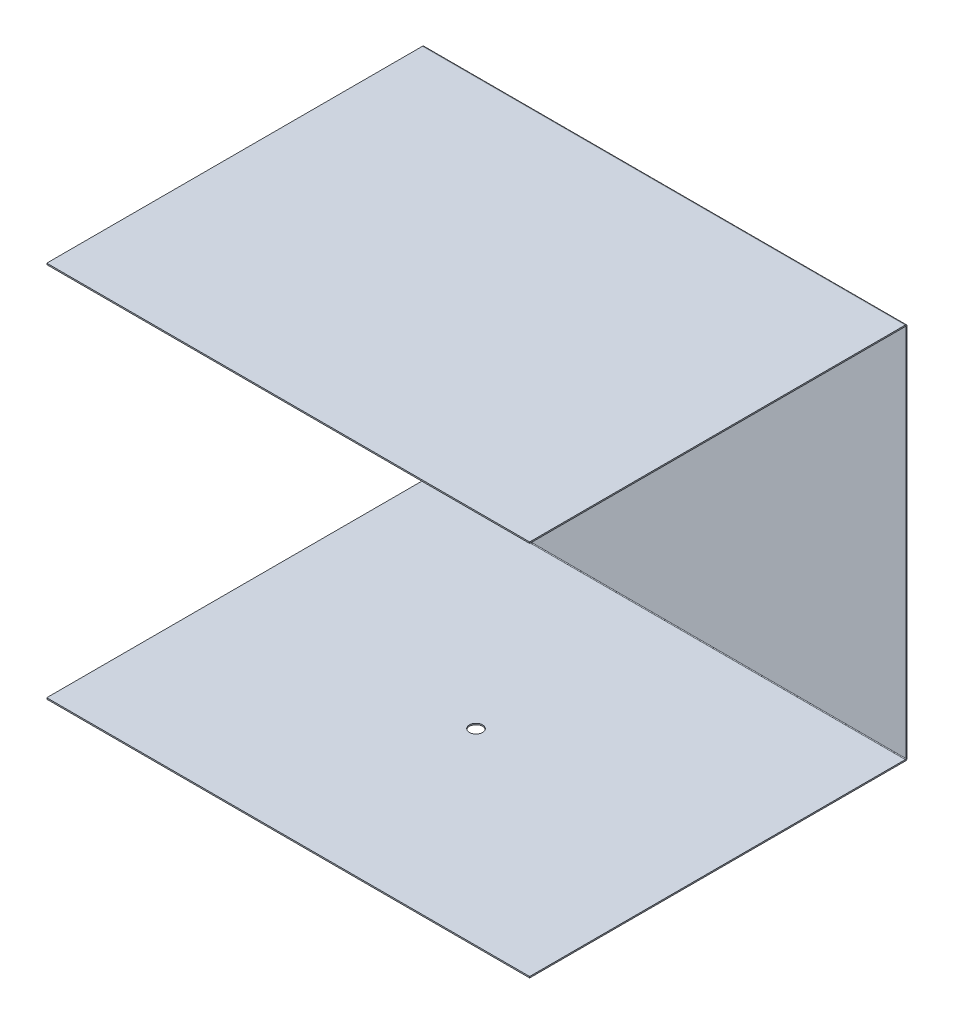
ISO-10303-21;
HEADER;
FILE_DESCRIPTION(('STEP AP214'),'2;1');
FILE_NAME('part.step','',(''),(''),'','','');
FILE_SCHEMA(('AUTOMOTIVE_DESIGN { 1 0 10303 214 1 1 1 1 }'));
ENDSEC;
DATA;
#1=APPLICATION_CONTEXT('core data for automotive mechanical design processes');
#2=APPLICATION_PROTOCOL_DEFINITION('international standard','automotive_design',2000,#1);
#3=PRODUCT_CONTEXT('',#1,'mechanical');
#4=PRODUCT('Part','Part','',(#3));
#5=PRODUCT_RELATED_PRODUCT_CATEGORY('part','',(#4));
#6=PRODUCT_DEFINITION_FORMATION('','',#4);
#7=PRODUCT_DEFINITION_CONTEXT('part definition',#1,'design');
#8=PRODUCT_DEFINITION('design','',#6,#7);
#9=PRODUCT_DEFINITION_SHAPE('','',#8);
#10=(LENGTH_UNIT() NAMED_UNIT(*) SI_UNIT(.MILLI.,.METRE.));
#11=(NAMED_UNIT(*) PLANE_ANGLE_UNIT() SI_UNIT($,.RADIAN.));
#12=(NAMED_UNIT(*) SI_UNIT($,.STERADIAN.) SOLID_ANGLE_UNIT());
#13=UNCERTAINTY_MEASURE_WITH_UNIT(LENGTH_MEASURE(1.E-05),#10,'distance_accuracy_value','');
#14=(GEOMETRIC_REPRESENTATION_CONTEXT(3) GLOBAL_UNCERTAINTY_ASSIGNED_CONTEXT((#13)) GLOBAL_UNIT_ASSIGNED_CONTEXT((#10,
#11,#12)) REPRESENTATION_CONTEXT('',''));
#15=CARTESIAN_POINT('',(0.,0.,0.));
#16=DIRECTION('',(0.,0.,1.));
#17=DIRECTION('',(1.,0.,0.));
#18=AXIS2_PLACEMENT_3D('',#15,#16,#17);
#19=CARTESIAN_POINT('',(0.,0.,-1.5));
#20=DIRECTION('',(0.,0.,-1.));
#21=DIRECTION('',(-1.,0.,0.));
#22=AXIS2_PLACEMENT_3D('',#19,#20,#21);
#23=PLANE('',#22);
#24=DIRECTION('',(0.,-1.,0.));
#25=VECTOR('',#24,1.);
#26=CARTESIAN_POINT('',(0.,0.,-1.5));
#27=LINE('',#26,#25);
#28=CARTESIAN_POINT('',(0.,855.832427090293,-1.5));
#29=VERTEX_POINT('',#28);
#30=CARTESIAN_POINT('',(0.,430.167572909707,-1.49999999999999));
#31=VERTEX_POINT('',#30);
#32=EDGE_CURVE('E50',#29,#31,#27,.T.);
#33=ORIENTED_EDGE('',*,*,#32,.F.);
#34=DIRECTION('',(1.,0.,0.));
#35=VECTOR('',#34,1.);
#36=CARTESIAN_POINT('',(0.,855.832427090293,-1.5));
#37=LINE('',#36,#35);
#38=CARTESIAN_POINT('',(550.,855.832427090293,-1.5));
#39=VERTEX_POINT('',#38);
#40=EDGE_CURVE('E231',#29,#39,#37,.T.);
#41=ORIENTED_EDGE('',*,*,#40,.T.);
#42=DIRECTION('',(0.,1.,0.));
#43=VECTOR('',#42,1.);
#44=CARTESIAN_POINT('',(550.,0.,-1.5));
#45=LINE('',#44,#43);
#46=CARTESIAN_POINT('',(550.,430.167572909707,-1.5));
#47=VERTEX_POINT('',#46);
#48=EDGE_CURVE('E237',#47,#39,#45,.T.);
#49=ORIENTED_EDGE('',*,*,#48,.F.);
#50=DIRECTION('',(1.,0.,0.));
#51=VECTOR('',#50,1.);
#52=CARTESIAN_POINT('',(0.,430.167572909707,-1.5));
#53=LINE('',#52,#51);
#54=EDGE_CURVE('E188',#31,#47,#53,.T.);
#55=ORIENTED_EDGE('',*,*,#54,.F.);
#56=EDGE_LOOP('',(#33,#41,#49,#55));
#57=FACE_BOUND('',#56,.T.);
#58=ADVANCED_FACE('F46',(#57),#23,.T.);
#59=CARTESIAN_POINT('',(0.,0.,-1.5));
#60=DIRECTION('',(-1.,0.,0.));
#61=DIRECTION('',(0.,0.,1.));
#62=AXIS2_PLACEMENT_3D('',#59,#60,#61);
#63=PLANE('',#62);
#64=DIRECTION('',(0.,-1.,0.));
#65=VECTOR('',#64,1.);
#66=CARTESIAN_POINT('',(0.,0.,0.));
#67=LINE('',#66,#65);
#68=CARTESIAN_POINT('',(0.,855.832427090293,0.));
#69=VERTEX_POINT('',#68);
#70=CARTESIAN_POINT('',(0.,430.167572909707,0.));
#71=VERTEX_POINT('',#70);
#72=EDGE_CURVE('E197',#69,#71,#67,.T.);
#73=ORIENTED_EDGE('',*,*,#72,.F.);
#74=DIRECTION('',(0.,0.,-1.));
#75=VECTOR('',#74,1.);
#76=CARTESIAN_POINT('',(0.,855.832427090293,-1.49999999999402));
#77=LINE('',#76,#75);
#78=EDGE_CURVE('E241',#69,#29,#77,.T.);
#79=ORIENTED_EDGE('',*,*,#78,.T.);
#80=ORIENTED_EDGE('',*,*,#32,.T.);
#81=DIRECTION('',(0.,0.,-1.));
#82=VECTOR('',#81,1.);
#83=CARTESIAN_POINT('',(0.,430.167572909707,-1.499999999997));
#84=LINE('',#83,#82);
#85=EDGE_CURVE('E198',#71,#31,#84,.T.);
#86=ORIENTED_EDGE('',*,*,#85,.F.);
#87=EDGE_LOOP('',(#73,#79,#80,#86));
#88=FACE_BOUND('',#87,.T.);
#89=ADVANCED_FACE('F255',(#88),#63,.T.);
#90=CARTESIAN_POINT('',(550.,0.,-1.5));
#91=DIRECTION('',(1.,0.,0.));
#92=DIRECTION('',(0.,0.,-1.));
#93=AXIS2_PLACEMENT_3D('',#90,#91,#92);
#94=PLANE('',#93);
#95=ORIENTED_EDGE('',*,*,#48,.T.);
#96=DIRECTION('',(0.,0.,1.));
#97=VECTOR('',#96,1.);
#98=CARTESIAN_POINT('',(550.,855.832427090293,-1.49999999999402));
#99=LINE('',#98,#97);
#100=CARTESIAN_POINT('',(550.,855.832427090293,0.));
#101=VERTEX_POINT('',#100);
#102=EDGE_CURVE('E12',#39,#101,#99,.T.);
#103=ORIENTED_EDGE('',*,*,#102,.T.);
#104=DIRECTION('',(0.,1.,0.));
#105=VECTOR('',#104,1.);
#106=CARTESIAN_POINT('',(550.,0.,0.));
#107=LINE('',#106,#105);
#108=CARTESIAN_POINT('',(550.,430.167572909707,0.));
#109=VERTEX_POINT('',#108);
#110=EDGE_CURVE('E196',#109,#101,#107,.T.);
#111=ORIENTED_EDGE('',*,*,#110,.F.);
#112=DIRECTION('',(0.,0.,1.));
#113=VECTOR('',#112,1.);
#114=CARTESIAN_POINT('',(550.,430.167572909707,-1.499999999997));
#115=LINE('',#114,#113);
#116=EDGE_CURVE('E201',#47,#109,#115,.T.);
#117=ORIENTED_EDGE('',*,*,#116,.F.);
#118=EDGE_LOOP('',(#95,#103,#111,#117));
#119=FACE_BOUND('',#118,.T.);
#120=ADVANCED_FACE('F48',(#119),#94,.T.);
#121=CARTESIAN_POINT('',(0.,427.930972909708,428.569027090293));
#122=DIRECTION('',(-1.,0.,0.));
#123=DIRECTION('',(0.,1.,0.));
#124=AXIS2_PLACEMENT_3D('',#121,#122,#123);
#125=PLANE('',#124);
#126=DIRECTION('',(0.,0.,1.));
#127=VECTOR('',#126,1.);
#128=CARTESIAN_POINT('',(0.,429.430972909708,428.569027090293));
#129=LINE('',#128,#127);
#130=CARTESIAN_POINT('',(0.,429.430972909707,0.736599999999975));
#131=VERTEX_POINT('',#130);
#132=CARTESIAN_POINT('',(0.,429.430972909708,428.569027090293));
#133=VERTEX_POINT('',#132);
#134=EDGE_CURVE('E214',#131,#133,#129,.T.);
#135=ORIENTED_EDGE('',*,*,#134,.F.);
#136=DIRECTION('',(0.,-1.,0.));
#137=VECTOR('',#136,1.);
#138=CARTESIAN_POINT('',(0.,427.93097290971,0.736600000000032));
#139=LINE('',#138,#137);
#140=CARTESIAN_POINT('',(0.,427.930972909707,0.736599999999924));
#141=VERTEX_POINT('',#140);
#142=EDGE_CURVE('E223',#131,#141,#139,.T.);
#143=ORIENTED_EDGE('',*,*,#142,.T.);
#144=DIRECTION('',(0.,0.,1.));
#145=VECTOR('',#144,1.);
#146=CARTESIAN_POINT('',(0.,427.930972909708,428.569027090293));
#147=LINE('',#146,#145);
#148=CARTESIAN_POINT('',(0.,427.930972909708,428.569027090293));
#149=VERTEX_POINT('',#148);
#150=EDGE_CURVE('E209',#141,#149,#147,.T.);
#151=ORIENTED_EDGE('',*,*,#150,.T.);
#152=DIRECTION('',(0.,1.,0.));
#153=VECTOR('',#152,1.);
#154=CARTESIAN_POINT('',(0.,427.930972909708,428.569027090293));
#155=LINE('',#154,#153);
#156=EDGE_CURVE('E218',#149,#133,#155,.T.);
#157=ORIENTED_EDGE('',*,*,#156,.T.);
#158=EDGE_LOOP('',(#135,#143,#151,#157));
#159=FACE_BOUND('',#158,.T.);
#160=ADVANCED_FACE('F278',(#159),#125,.T.);
#161=CARTESIAN_POINT('',(550.,427.930972909708,428.569027090293));
#162=DIRECTION('',(1.,0.,0.));
#163=DIRECTION('',(0.,-1.,0.));
#164=AXIS2_PLACEMENT_3D('',#161,#162,#163);
#165=PLANE('',#164);
#166=DIRECTION('',(0.,0.,-1.));
#167=VECTOR('',#166,1.);
#168=CARTESIAN_POINT('',(550.,427.930972909708,428.569027090293));
#169=LINE('',#168,#167);
#170=CARTESIAN_POINT('',(550.,427.930972909708,428.569027090293));
#171=VERTEX_POINT('',#170);
#172=CARTESIAN_POINT('',(550.,427.930972909707,0.736600000000032));
#173=VERTEX_POINT('',#172);
#174=EDGE_CURVE('E208',#171,#173,#169,.T.);
#175=ORIENTED_EDGE('',*,*,#174,.T.);
#176=DIRECTION('',(0.,1.,0.));
#177=VECTOR('',#176,1.);
#178=CARTESIAN_POINT('',(550.,427.93097290971,0.736600000000032));
#179=LINE('',#178,#177);
#180=CARTESIAN_POINT('',(550.,429.430972909707,0.736599999999975));
#181=VERTEX_POINT('',#180);
#182=EDGE_CURVE('E228',#173,#181,#179,.T.);
#183=ORIENTED_EDGE('',*,*,#182,.T.);
#184=DIRECTION('',(0.,0.,-1.));
#185=VECTOR('',#184,1.);
#186=CARTESIAN_POINT('',(550.,429.430972909708,428.569027090293));
#187=LINE('',#186,#185);
#188=CARTESIAN_POINT('',(550.,429.430972909708,428.569027090293));
#189=VERTEX_POINT('',#188);
#190=EDGE_CURVE('E213',#189,#181,#187,.T.);
#191=ORIENTED_EDGE('',*,*,#190,.F.);
#192=DIRECTION('',(0.,1.,0.));
#193=VECTOR('',#192,1.);
#194=CARTESIAN_POINT('',(550.,427.930972909708,428.569027090293));
#195=LINE('',#194,#193);
#196=EDGE_CURVE('E215',#171,#189,#195,.T.);
#197=ORIENTED_EDGE('',*,*,#196,.F.);
#198=EDGE_LOOP('',(#175,#183,#191,#197));
#199=FACE_BOUND('',#198,.T.);
#200=ADVANCED_FACE('F270',(#199),#165,.T.);
#201=CARTESIAN_POINT('',(0.,427.930972909708,428.569027090293));
#202=DIRECTION('',(0.,-1.,0.));
#203=DIRECTION('',(-1.,0.,0.));
#204=AXIS2_PLACEMENT_3D('',#201,#202,#203);
#205=PLANE('',#204);
#206=CARTESIAN_POINT('',(275.,427.930972909707,214.652813545147));
#207=DIRECTION('',(0.,-1.,0.));
#208=DIRECTION('',(0.,0.,-1.));
#209=AXIS2_PLACEMENT_3D('',#206,#207,#208);
#210=CIRCLE('',#209,7.50000000000001);
#211=CARTESIAN_POINT('',(275.,427.930972909707,207.152813545147));
#212=VERTEX_POINT('',#211);
#213=EDGE_CURVE('E312',#212,#212,#210,.T.);
#214=ORIENTED_EDGE('',*,*,#213,.F.);
#215=EDGE_LOOP('',(#214));
#216=FACE_BOUND('',#215,.T.);
#217=ORIENTED_EDGE('',*,*,#150,.F.);
#218=DIRECTION('',(1.,0.,0.));
#219=VECTOR('',#218,1.);
#220=CARTESIAN_POINT('',(0.,427.930972909707,0.736600000000032));
#221=LINE('',#220,#219);
#222=EDGE_CURVE('E217',#141,#173,#221,.T.);
#223=ORIENTED_EDGE('',*,*,#222,.T.);
#224=ORIENTED_EDGE('',*,*,#174,.F.);
#225=DIRECTION('',(1.,0.,0.));
#226=VECTOR('',#225,1.);
#227=CARTESIAN_POINT('',(0.,427.930972909708,428.569027090293));
#228=LINE('',#227,#226);
#229=EDGE_CURVE('E205',#149,#171,#228,.T.);
#230=ORIENTED_EDGE('',*,*,#229,.F.);
#231=EDGE_LOOP('',(#217,#223,#224,#230));
#232=FACE_BOUND('',#231,.T.);
#233=ADVANCED_FACE('F267',(#216,#232),#205,.T.);
#234=CARTESIAN_POINT('',(0.,427.930972909708,428.569027090293));
#235=DIRECTION('',(0.,0.,1.));
#236=DIRECTION('',(0.,-1.,0.));
#237=AXIS2_PLACEMENT_3D('',#234,#235,#236);
#238=PLANE('',#237);
#239=DIRECTION('',(1.,0.,0.));
#240=VECTOR('',#239,1.);
#241=CARTESIAN_POINT('',(0.,429.430972909708,428.569027090293));
#242=LINE('',#241,#240);
#243=EDGE_CURVE('E210',#133,#189,#242,.T.);
#244=ORIENTED_EDGE('',*,*,#243,.F.);
#245=ORIENTED_EDGE('',*,*,#156,.F.);
#246=ORIENTED_EDGE('',*,*,#229,.T.);
#247=ORIENTED_EDGE('',*,*,#196,.T.);
#248=EDGE_LOOP('',(#244,#245,#246,#247));
#249=FACE_BOUND('',#248,.T.);
#250=ADVANCED_FACE('F274',(#249),#238,.T.);
#251=CARTESIAN_POINT('',(0.,429.430972909708,428.569027090293));
#252=DIRECTION('',(0.,-1.,0.));
#253=DIRECTION('',(-1.,0.,0.));
#254=AXIS2_PLACEMENT_3D('',#251,#252,#253);
#255=PLANE('',#254);
#256=CARTESIAN_POINT('',(275.,429.430972909707,214.652813545147));
#257=DIRECTION('',(0.,-1.,0.));
#258=DIRECTION('',(0.,0.,-1.));
#259=AXIS2_PLACEMENT_3D('',#256,#257,#258);
#260=CIRCLE('',#259,7.50000000000001);
#261=CARTESIAN_POINT('',(275.,429.430972909707,207.152813545147));
#262=VERTEX_POINT('',#261);
#263=EDGE_CURVE('E172',#262,#262,#260,.F.);
#264=ORIENTED_EDGE('',*,*,#263,.F.);
#265=EDGE_LOOP('',(#264));
#266=FACE_BOUND('',#265,.T.);
#267=DIRECTION('',(1.,0.,0.));
#268=VECTOR('',#267,1.);
#269=CARTESIAN_POINT('',(0.,429.430972909707,0.736600000000032));
#270=LINE('',#269,#268);
#271=EDGE_CURVE('E226',#131,#181,#270,.T.);
#272=ORIENTED_EDGE('',*,*,#271,.F.);
#273=ORIENTED_EDGE('',*,*,#134,.T.);
#274=ORIENTED_EDGE('',*,*,#243,.T.);
#275=ORIENTED_EDGE('',*,*,#190,.T.);
#276=EDGE_LOOP('',(#272,#273,#274,#275));
#277=FACE_BOUND('',#276,.T.);
#278=ADVANCED_FACE('F320',(#266,#277),#255,.F.);
#279=CARTESIAN_POINT('',(0.,0.,0.));
#280=DIRECTION('',(0.,0.,-1.));
#281=DIRECTION('',(-1.,0.,0.));
#282=AXIS2_PLACEMENT_3D('',#279,#280,#281);
#283=PLANE('',#282);
#284=DIRECTION('',(1.,0.,0.));
#285=VECTOR('',#284,1.);
#286=CARTESIAN_POINT('',(0.,855.832427090293,0.));
#287=LINE('',#286,#285);
#288=EDGE_CURVE('E55',#69,#101,#287,.T.);
#289=ORIENTED_EDGE('',*,*,#288,.F.);
#290=ORIENTED_EDGE('',*,*,#72,.T.);
#291=DIRECTION('',(1.,0.,0.));
#292=VECTOR('',#291,1.);
#293=CARTESIAN_POINT('',(0.,430.167572909707,0.));
#294=LINE('',#293,#292);
#295=EDGE_CURVE('E193',#71,#109,#294,.T.);
#296=ORIENTED_EDGE('',*,*,#295,.T.);
#297=ORIENTED_EDGE('',*,*,#110,.T.);
#298=EDGE_LOOP('',(#289,#290,#296,#297));
#299=FACE_BOUND('',#298,.T.);
#300=ADVANCED_FACE('F283',(#299),#283,.F.);
#301=CARTESIAN_POINT('',(0.,430.167572909707,0.7366));
#302=DIRECTION('',(-1.,0.,0.));
#303=DIRECTION('',(0.,-1.,0.));
#304=AXIS2_PLACEMENT_3D('',#301,#302,#303);
#305=PLANE('',#304);
#306=ORIENTED_EDGE('',*,*,#142,.F.);
#307=CARTESIAN_POINT('',(0.,430.167572909707,0.7366));
#308=DIRECTION('',(-1.,0.,0.));
#309=DIRECTION('',(0.,-1.,0.));
#310=AXIS2_PLACEMENT_3D('',#307,#308,#309);
#311=CIRCLE('',#310,0.7366);
#312=EDGE_CURVE('E179',#131,#71,#311,.F.);
#313=ORIENTED_EDGE('',*,*,#312,.T.);
#314=ORIENTED_EDGE('',*,*,#85,.T.);
#315=CARTESIAN_POINT('',(0.,430.167572909707,0.7366));
#316=DIRECTION('',(1.,0.,0.));
#317=DIRECTION('',(0.,-1.,0.));
#318=AXIS2_PLACEMENT_3D('',#315,#316,#317);
#319=CIRCLE('',#318,2.23659999999999);
#320=EDGE_CURVE('E183',#141,#31,#319,.T.);
#321=ORIENTED_EDGE('',*,*,#320,.F.);
#322=EDGE_LOOP('',(#306,#313,#314,#321));
#323=FACE_BOUND('',#322,.T.);
#324=ADVANCED_FACE('F261',(#323),#305,.T.);
#325=CARTESIAN_POINT('',(550.,430.167572909707,0.7366));
#326=DIRECTION('',(1.,0.,0.));
#327=DIRECTION('',(0.,0.,-1.));
#328=AXIS2_PLACEMENT_3D('',#325,#326,#327);
#329=PLANE('',#328);
#330=CARTESIAN_POINT('',(550.,430.167572909707,0.7366));
#331=DIRECTION('',(-1.,0.,0.));
#332=DIRECTION('',(0.,-1.,0.));
#333=AXIS2_PLACEMENT_3D('',#330,#331,#332);
#334=CIRCLE('',#333,0.7366);
#335=EDGE_CURVE('E186',#109,#181,#334,.T.);
#336=ORIENTED_EDGE('',*,*,#335,.T.);
#337=ORIENTED_EDGE('',*,*,#182,.F.);
#338=CARTESIAN_POINT('',(550.,430.167572909707,0.7366));
#339=DIRECTION('',(-1.,0.,0.));
#340=DIRECTION('',(0.,0.,-1.));
#341=AXIS2_PLACEMENT_3D('',#338,#339,#340);
#342=CIRCLE('',#341,2.23659999999999);
#343=EDGE_CURVE('E71',#47,#173,#342,.T.);
#344=ORIENTED_EDGE('',*,*,#343,.F.);
#345=ORIENTED_EDGE('',*,*,#116,.T.);
#346=EDGE_LOOP('',(#336,#337,#344,#345));
#347=FACE_BOUND('',#346,.T.);
#348=ADVANCED_FACE('F285',(#347),#329,.T.);
#349=CARTESIAN_POINT('',(825.007002597238,430.167572909707,0.7366));
#350=DIRECTION('',(-1.,0.,0.));
#351=DIRECTION('',(0.,-1.,0.));
#352=AXIS2_PLACEMENT_3D('',#349,#350,#351);
#353=CYLINDRICAL_SURFACE('',#352,2.2366);
#354=ORIENTED_EDGE('',*,*,#54,.T.);
#355=ORIENTED_EDGE('',*,*,#343,.T.);
#356=ORIENTED_EDGE('',*,*,#222,.F.);
#357=ORIENTED_EDGE('',*,*,#320,.T.);
#358=EDGE_LOOP('',(#354,#355,#356,#357));
#359=FACE_BOUND('',#358,.T.);
#360=ADVANCED_FACE('F264',(#359),#353,.T.);
#361=CARTESIAN_POINT('',(825.007002597238,430.167572909707,0.7366));
#362=DIRECTION('',(-1.,0.,0.));
#363=DIRECTION('',(0.,-1.,0.));
#364=AXIS2_PLACEMENT_3D('',#361,#362,#363);
#365=CYLINDRICAL_SURFACE('',#364,0.7366);
#366=ORIENTED_EDGE('',*,*,#295,.F.);
#367=ORIENTED_EDGE('',*,*,#312,.F.);
#368=ORIENTED_EDGE('',*,*,#271,.T.);
#369=ORIENTED_EDGE('',*,*,#335,.F.);
#370=EDGE_LOOP('',(#366,#367,#368,#369));
#371=FACE_BOUND('',#370,.T.);
#372=ADVANCED_FACE('F281',(#371),#365,.F.);
#373=CARTESIAN_POINT('',(0.,855.832427090293,0.7366));
#374=DIRECTION('',(-1.,0.,0.));
#375=DIRECTION('',(0.,0.,1.));
#376=AXIS2_PLACEMENT_3D('',#373,#374,#375);
#377=PLANE('',#376);
#378=ORIENTED_EDGE('',*,*,#78,.F.);
#379=CARTESIAN_POINT('',(0.,855.832427090293,0.7366));
#380=DIRECTION('',(1.,0.,0.));
#381=DIRECTION('',(0.,0.,-1.));
#382=AXIS2_PLACEMENT_3D('',#379,#380,#381);
#383=CIRCLE('',#382,0.7366);
#384=CARTESIAN_POINT('',(0.,856.569027090293,0.736599999999976));
#385=VERTEX_POINT('',#384);
#386=EDGE_CURVE('E155',#69,#385,#383,.T.);
#387=ORIENTED_EDGE('',*,*,#386,.T.);
#388=DIRECTION('',(0.,1.,0.));
#389=VECTOR('',#388,1.);
#390=CARTESIAN_POINT('',(0.,858.069027090287,0.736599999999976));
#391=LINE('',#390,#389);
#392=CARTESIAN_POINT('',(0.,858.069027090293,0.736599999999976));
#393=VERTEX_POINT('',#392);
#394=EDGE_CURVE('E162',#385,#393,#391,.T.);
#395=ORIENTED_EDGE('',*,*,#394,.T.);
#396=CARTESIAN_POINT('',(0.,855.832427090293,0.7366));
#397=DIRECTION('',(1.,0.,0.));
#398=DIRECTION('',(0.,0.,1.));
#399=AXIS2_PLACEMENT_3D('',#396,#397,#398);
#400=CIRCLE('',#399,2.23660000000002);
#401=EDGE_CURVE('E173',#29,#393,#400,.T.);
#402=ORIENTED_EDGE('',*,*,#401,.F.);
#403=EDGE_LOOP('',(#378,#387,#395,#402));
#404=FACE_BOUND('',#403,.T.);
#405=ADVANCED_FACE('F299',(#404),#377,.T.);
#406=CARTESIAN_POINT('',(550.,855.832427090293,0.7366));
#407=DIRECTION('',(1.,0.,0.));
#408=DIRECTION('',(0.,0.,-1.));
#409=AXIS2_PLACEMENT_3D('',#406,#407,#408);
#410=PLANE('',#409);
#411=CARTESIAN_POINT('',(550.,855.832427090293,0.7366));
#412=DIRECTION('',(1.,0.,0.));
#413=DIRECTION('',(0.,0.,-1.));
#414=AXIS2_PLACEMENT_3D('',#411,#412,#413);
#415=CIRCLE('',#414,0.7366);
#416=CARTESIAN_POINT('',(550.,856.569027090293,0.736599999999976));
#417=VERTEX_POINT('',#416);
#418=EDGE_CURVE('E63',#417,#101,#415,.F.);
#419=ORIENTED_EDGE('',*,*,#418,.T.);
#420=ORIENTED_EDGE('',*,*,#102,.F.);
#421=CARTESIAN_POINT('',(550.,855.832427090293,0.7366));
#422=DIRECTION('',(-1.,0.,0.));
#423=DIRECTION('',(0.,0.,-1.));
#424=AXIS2_PLACEMENT_3D('',#421,#422,#423);
#425=CIRCLE('',#424,2.23660000000002);
#426=CARTESIAN_POINT('',(550.,858.069027090293,0.736600000000175));
#427=VERTEX_POINT('',#426);
#428=EDGE_CURVE('E176',#427,#39,#425,.T.);
#429=ORIENTED_EDGE('',*,*,#428,.F.);
#430=DIRECTION('',(0.,-1.,0.));
#431=VECTOR('',#430,1.);
#432=CARTESIAN_POINT('',(550.,858.069027090287,0.736599999999976));
#433=LINE('',#432,#431);
#434=EDGE_CURVE('E144',#427,#417,#433,.T.);
#435=ORIENTED_EDGE('',*,*,#434,.T.);
#436=EDGE_LOOP('',(#419,#420,#429,#435));
#437=FACE_BOUND('',#436,.T.);
#438=ADVANCED_FACE('F288',(#437),#410,.T.);
#439=CARTESIAN_POINT('',(-275.007002597238,855.832427090293,0.7366));
#440=DIRECTION('',(1.,0.,0.));
#441=DIRECTION('',(0.,0.,-1.));
#442=AXIS2_PLACEMENT_3D('',#439,#440,#441);
#443=CYLINDRICAL_SURFACE('',#442,2.2366);
#444=DIRECTION('',(1.,0.,0.));
#445=VECTOR('',#444,1.);
#446=CARTESIAN_POINT('',(0.,858.069027090293,0.736599999999976));
#447=LINE('',#446,#445);
#448=EDGE_CURVE('E170',#393,#427,#447,.T.);
#449=ORIENTED_EDGE('',*,*,#448,.T.);
#450=ORIENTED_EDGE('',*,*,#428,.T.);
#451=ORIENTED_EDGE('',*,*,#40,.F.);
#452=ORIENTED_EDGE('',*,*,#401,.T.);
#453=EDGE_LOOP('',(#449,#450,#451,#452));
#454=FACE_BOUND('',#453,.T.);
#455=ADVANCED_FACE('F290',(#454),#443,.T.);
#456=CARTESIAN_POINT('',(-275.007002597238,855.832427090293,0.7366));
#457=DIRECTION('',(1.,0.,0.));
#458=DIRECTION('',(0.,0.,-1.));
#459=AXIS2_PLACEMENT_3D('',#456,#457,#458);
#460=CYLINDRICAL_SURFACE('',#459,0.7366);
#461=DIRECTION('',(1.,0.,0.));
#462=VECTOR('',#461,1.);
#463=CARTESIAN_POINT('',(0.,856.569027090293,0.736599999999976));
#464=LINE('',#463,#462);
#465=EDGE_CURVE('E304',#385,#417,#464,.T.);
#466=ORIENTED_EDGE('',*,*,#465,.F.);
#467=ORIENTED_EDGE('',*,*,#386,.F.);
#468=ORIENTED_EDGE('',*,*,#288,.T.);
#469=ORIENTED_EDGE('',*,*,#418,.F.);
#470=EDGE_LOOP('',(#466,#467,#468,#469));
#471=FACE_BOUND('',#470,.T.);
#472=ADVANCED_FACE('F302',(#471),#460,.F.);
#473=CARTESIAN_POINT('',(0.,858.069027090292,428.569027090293));
#474=DIRECTION('',(0.,0.,1.));
#475=DIRECTION('',(0.,-1.,0.));
#476=AXIS2_PLACEMENT_3D('',#473,#474,#475);
#477=PLANE('',#476);
#478=DIRECTION('',(-1.,0.,0.));
#479=VECTOR('',#478,1.);
#480=CARTESIAN_POINT('',(0.,856.569027090292,428.569027090293));
#481=LINE('',#480,#479);
#482=CARTESIAN_POINT('',(550.,856.569027090292,428.569027090293));
#483=VERTEX_POINT('',#482);
#484=CARTESIAN_POINT('',(0.,856.569027090292,428.569027090293));
#485=VERTEX_POINT('',#484);
#486=EDGE_CURVE('E148',#483,#485,#481,.T.);
#487=ORIENTED_EDGE('',*,*,#486,.F.);
#488=DIRECTION('',(0.,-1.,0.));
#489=VECTOR('',#488,1.);
#490=CARTESIAN_POINT('',(550.,858.069027090292,428.569027090293));
#491=LINE('',#490,#489);
#492=CARTESIAN_POINT('',(550.,858.069027090292,428.569027090293));
#493=VERTEX_POINT('',#492);
#494=EDGE_CURVE('E142',#493,#483,#491,.T.);
#495=ORIENTED_EDGE('',*,*,#494,.F.);
#496=DIRECTION('',(-1.,0.,0.));
#497=VECTOR('',#496,1.);
#498=CARTESIAN_POINT('',(0.,858.069027090292,428.569027090293));
#499=LINE('',#498,#497);
#500=CARTESIAN_POINT('',(0.,858.069027090292,428.569027090293));
#501=VERTEX_POINT('',#500);
#502=EDGE_CURVE('E153',#493,#501,#499,.T.);
#503=ORIENTED_EDGE('',*,*,#502,.T.);
#504=DIRECTION('',(0.,-1.,0.));
#505=VECTOR('',#504,1.);
#506=CARTESIAN_POINT('',(0.,858.069027090292,428.569027090293));
#507=LINE('',#506,#505);
#508=EDGE_CURVE('E161',#501,#485,#507,.T.);
#509=ORIENTED_EDGE('',*,*,#508,.T.);
#510=EDGE_LOOP('',(#487,#495,#503,#509));
#511=FACE_BOUND('',#510,.T.);
#512=ADVANCED_FACE('F152',(#511),#477,.T.);
#513=CARTESIAN_POINT('',(0.,858.069027090296,-857.430972909707));
#514=DIRECTION('',(0.,1.,0.));
#515=DIRECTION('',(-1.,0.,0.));
#516=AXIS2_PLACEMENT_3D('',#513,#514,#515);
#517=PLANE('',#516);
#518=ORIENTED_EDGE('',*,*,#448,.F.);
#519=DIRECTION('',(0.,0.,-1.));
#520=VECTOR('',#519,1.);
#521=CARTESIAN_POINT('',(0.,858.069027090296,-857.430972909707));
#522=LINE('',#521,#520);
#523=EDGE_CURVE('E160',#501,#393,#522,.T.);
#524=ORIENTED_EDGE('',*,*,#523,.F.);
#525=ORIENTED_EDGE('',*,*,#502,.F.);
#526=DIRECTION('',(0.,0.,1.));
#527=VECTOR('',#526,1.);
#528=CARTESIAN_POINT('',(550.,858.069027090296,-857.430972909707));
#529=LINE('',#528,#527);
#530=EDGE_CURVE('E139',#427,#493,#529,.T.);
#531=ORIENTED_EDGE('',*,*,#530,.F.);
#532=EDGE_LOOP('',(#518,#524,#525,#531));
#533=FACE_BOUND('',#532,.T.);
#534=ADVANCED_FACE('F158',(#533),#517,.T.);
#535=CARTESIAN_POINT('',(0.,858.069027090296,-857.430972909707));
#536=DIRECTION('',(-1.,0.,0.));
#537=DIRECTION('',(0.,-1.,0.));
#538=AXIS2_PLACEMENT_3D('',#535,#536,#537);
#539=PLANE('',#538);
#540=ORIENTED_EDGE('',*,*,#394,.F.);
#541=DIRECTION('',(0.,0.,-1.));
#542=VECTOR('',#541,1.);
#543=CARTESIAN_POINT('',(0.,856.569027090296,-857.430972909707));
#544=LINE('',#543,#542);
#545=EDGE_CURVE('E297',#485,#385,#544,.T.);
#546=ORIENTED_EDGE('',*,*,#545,.F.);
#547=ORIENTED_EDGE('',*,*,#508,.F.);
#548=ORIENTED_EDGE('',*,*,#523,.T.);
#549=EDGE_LOOP('',(#540,#546,#547,#548));
#550=FACE_BOUND('',#549,.T.);
#551=ADVANCED_FACE('F294',(#550),#539,.T.);
#552=CARTESIAN_POINT('',(0.,856.569027090296,-857.430972909707));
#553=DIRECTION('',(0.,1.,0.));
#554=DIRECTION('',(-1.,0.,0.));
#555=AXIS2_PLACEMENT_3D('',#552,#553,#554);
#556=PLANE('',#555);
#557=ORIENTED_EDGE('',*,*,#545,.T.);
#558=ORIENTED_EDGE('',*,*,#465,.T.);
#559=DIRECTION('',(0.,0.,1.));
#560=VECTOR('',#559,1.);
#561=CARTESIAN_POINT('',(550.,856.569027090296,-857.430972909707));
#562=LINE('',#561,#560);
#563=EDGE_CURVE('E306',#417,#483,#562,.T.);
#564=ORIENTED_EDGE('',*,*,#563,.T.);
#565=ORIENTED_EDGE('',*,*,#486,.T.);
#566=EDGE_LOOP('',(#557,#558,#564,#565));
#567=FACE_BOUND('',#566,.T.);
#568=ADVANCED_FACE('F366',(#567),#556,.F.);
#569=CARTESIAN_POINT('',(550.,858.069027090296,-857.430972909707));
#570=DIRECTION('',(1.,0.,0.));
#571=DIRECTION('',(0.,1.,0.));
#572=AXIS2_PLACEMENT_3D('',#569,#570,#571);
#573=PLANE('',#572);
#574=ORIENTED_EDGE('',*,*,#434,.F.);
#575=ORIENTED_EDGE('',*,*,#530,.T.);
#576=ORIENTED_EDGE('',*,*,#494,.T.);
#577=ORIENTED_EDGE('',*,*,#563,.F.);
#578=EDGE_LOOP('',(#574,#575,#576,#577));
#579=FACE_BOUND('',#578,.T.);
#580=ADVANCED_FACE('F141',(#579),#573,.T.);
#581=CARTESIAN_POINT('',(275.,858.070027090294,214.652813545145));
#582=DIRECTION('',(0.,-1.,0.));
#583=DIRECTION('',(0.,0.,-1.));
#584=AXIS2_PLACEMENT_3D('',#581,#582,#583);
#585=CYLINDRICAL_SURFACE('',#584,7.50000000000001);
#586=ORIENTED_EDGE('',*,*,#213,.T.);
#587=EDGE_LOOP('',(#586));
#588=FACE_BOUND('',#587,.T.);
#589=ORIENTED_EDGE('',*,*,#263,.T.);
#590=EDGE_LOOP('',(#589));
#591=FACE_BOUND('',#590,.T.);
#592=ADVANCED_FACE('F318',(#588,#591),#585,.F.);
#593=CLOSED_SHELL('',(#58,#89,#120,#160,#200,#233,#250,#278,#300,#324,#348,#360,#372,#405,#438,
#455,#472,#512,#534,#551,#568,#580,#592));
#594=MANIFOLD_SOLID_BREP('B2',#593);
#595=ADVANCED_BREP_SHAPE_REPRESENTATION('',(#18,#594),#14);
#596=SHAPE_DEFINITION_REPRESENTATION(#9,#595);
ENDSEC;
END-ISO-10303-21;
